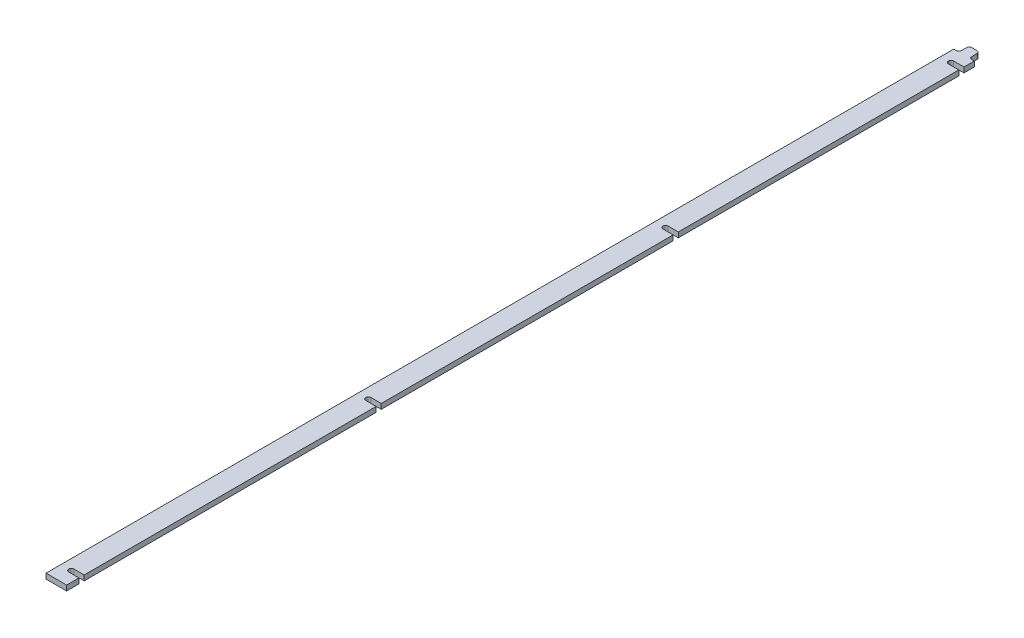
ISO-10303-21;
HEADER;
FILE_DESCRIPTION(('STEP AP214'),'2;1');
FILE_NAME('part.step','',(''),(''),'','','');
FILE_SCHEMA(('AUTOMOTIVE_DESIGN { 1 0 10303 214 1 1 1 1 }'));
ENDSEC;
DATA;
#1=APPLICATION_CONTEXT('core data for automotive mechanical design processes');
#2=APPLICATION_PROTOCOL_DEFINITION('international standard','automotive_design',2000,#1);
#3=PRODUCT_CONTEXT('',#1,'mechanical');
#4=PRODUCT('Part','Part','',(#3));
#5=PRODUCT_RELATED_PRODUCT_CATEGORY('part','',(#4));
#6=PRODUCT_DEFINITION_FORMATION('','',#4);
#7=PRODUCT_DEFINITION_CONTEXT('part definition',#1,'design');
#8=PRODUCT_DEFINITION('design','',#6,#7);
#9=PRODUCT_DEFINITION_SHAPE('','',#8);
#10=(LENGTH_UNIT() NAMED_UNIT(*) SI_UNIT(.MILLI.,.METRE.));
#11=(NAMED_UNIT(*) PLANE_ANGLE_UNIT() SI_UNIT($,.RADIAN.));
#12=(NAMED_UNIT(*) SI_UNIT($,.STERADIAN.) SOLID_ANGLE_UNIT());
#13=UNCERTAINTY_MEASURE_WITH_UNIT(LENGTH_MEASURE(1.E-05),#10,'distance_accuracy_value','');
#14=(GEOMETRIC_REPRESENTATION_CONTEXT(3) GLOBAL_UNCERTAINTY_ASSIGNED_CONTEXT((#13)) GLOBAL_UNIT_ASSIGNED_CONTEXT((#10,
#11,#12)) REPRESENTATION_CONTEXT('',''));
#15=CARTESIAN_POINT('',(0.,0.,0.));
#16=DIRECTION('',(0.,0.,1.));
#17=DIRECTION('',(1.,0.,0.));
#18=AXIS2_PLACEMENT_3D('',#15,#16,#17);
#19=CARTESIAN_POINT('',(-3.17500000000001,-0.000999999999999916,-139.7));
#20=DIRECTION('',(0.,0.,1.));
#21=DIRECTION('',(1.,0.,0.));
#22=AXIS2_PLACEMENT_3D('',#19,#20,#21);
#23=PLANE('',#22);
#24=DIRECTION('',(0.,1.,0.));
#25=VECTOR('',#24,1.);
#26=CARTESIAN_POINT('',(-0.793750000000008,-0.000999999999999916,-139.7));
#27=LINE('',#26,#25);
#28=CARTESIAN_POINT('',(-0.793750000000008,0.,-139.7));
#29=VERTEX_POINT('',#28);
#30=CARTESIAN_POINT('',(-0.793750000000008,1.5875,-139.7));
#31=VERTEX_POINT('',#30);
#32=EDGE_CURVE('E460',#29,#31,#27,.T.);
#33=ORIENTED_EDGE('',*,*,#32,.T.);
#34=DIRECTION('',(1.,0.,0.));
#35=VECTOR('',#34,1.);
#36=CARTESIAN_POINT('',(-3.17500000000001,1.5875,-139.7));
#37=LINE('',#36,#35);
#38=CARTESIAN_POINT('',(0.793749999999993,1.5875,-139.7));
#39=VERTEX_POINT('',#38);
#40=EDGE_CURVE('E519',#31,#39,#37,.T.);
#41=ORIENTED_EDGE('',*,*,#40,.T.);
#42=DIRECTION('',(0.,1.,0.));
#43=VECTOR('',#42,1.);
#44=CARTESIAN_POINT('',(0.793749999999993,-0.000999999999999916,-139.7));
#45=LINE('',#44,#43);
#46=CARTESIAN_POINT('',(0.793749999999993,0.,-139.7));
#47=VERTEX_POINT('',#46);
#48=EDGE_CURVE('E515',#47,#39,#45,.T.);
#49=ORIENTED_EDGE('',*,*,#48,.F.);
#50=DIRECTION('',(-1.,0.,0.));
#51=VECTOR('',#50,1.);
#52=CARTESIAN_POINT('',(-3.17500000000001,0.,-139.7));
#53=LINE('',#52,#51);
#54=EDGE_CURVE('E417',#47,#29,#53,.T.);
#55=ORIENTED_EDGE('',*,*,#54,.T.);
#56=EDGE_LOOP('',(#33,#41,#49,#55));
#57=FACE_BOUND('',#56,.T.);
#58=ADVANCED_FACE('F40',(#57),#23,.F.);
#59=CARTESIAN_POINT('',(3.17499999999999,1.5875,142.875));
#60=DIRECTION('',(-1.,0.,0.));
#61=DIRECTION('',(0.,0.,1.));
#62=AXIS2_PLACEMENT_3D('',#59,#60,#61);
#63=PLANE('',#62);
#64=DIRECTION('',(0.,0.,-1.));
#65=VECTOR('',#64,1.);
#66=CARTESIAN_POINT('',(3.17499999999999,0.,142.875));
#67=LINE('',#66,#65);
#68=CARTESIAN_POINT('',(3.17499999999999,0.,-45.4025));
#69=VERTEX_POINT('',#68);
#70=CARTESIAN_POINT('',(3.17499999999999,0.,-131.7498));
#71=VERTEX_POINT('',#70);
#72=EDGE_CURVE('E330',#69,#71,#67,.T.);
#73=ORIENTED_EDGE('',*,*,#72,.T.);
#74=DIRECTION('',(0.,1.,0.));
#75=VECTOR('',#74,1.);
#76=CARTESIAN_POINT('',(3.17499999999999,-0.000999999999999916,-131.7498));
#77=LINE('',#76,#75);
#78=CARTESIAN_POINT('',(3.17499999999999,1.5875,-131.7498));
#79=VERTEX_POINT('',#78);
#80=EDGE_CURVE('E470',#71,#79,#77,.T.);
#81=ORIENTED_EDGE('',*,*,#80,.T.);
#82=DIRECTION('',(0.,0.,-1.));
#83=VECTOR('',#82,1.);
#84=CARTESIAN_POINT('',(3.17499999999999,1.5875,142.875));
#85=LINE('',#84,#83);
#86=CARTESIAN_POINT('',(3.17499999999999,1.5875,-45.4025));
#87=VERTEX_POINT('',#86);
#88=EDGE_CURVE('E446',#87,#79,#85,.T.);
#89=ORIENTED_EDGE('',*,*,#88,.F.);
#90=DIRECTION('',(0.,1.,0.));
#91=VECTOR('',#90,1.);
#92=CARTESIAN_POINT('',(3.17499999999999,-0.000999999999999916,-45.4025));
#93=LINE('',#92,#91);
#94=EDGE_CURVE('E427',#69,#87,#93,.T.);
#95=ORIENTED_EDGE('',*,*,#94,.F.);
#96=EDGE_LOOP('',(#73,#81,#89,#95));
#97=FACE_BOUND('',#96,.T.);
#98=ADVANCED_FACE('F444',(#97),#63,.F.);
#99=CARTESIAN_POINT('',(3.17499999999999,0.,46.0375));
#100=VERTEX_POINT('',#99);
#101=CARTESIAN_POINT('',(3.17499999999999,0.,-43.815));
#102=VERTEX_POINT('',#101);
#103=EDGE_CURVE('E338',#100,#102,#67,.T.);
#104=ORIENTED_EDGE('',*,*,#103,.T.);
#105=DIRECTION('',(0.,1.,0.));
#106=VECTOR('',#105,1.);
#107=CARTESIAN_POINT('',(3.17499999999999,-0.000999999999999916,-43.815));
#108=LINE('',#107,#106);
#109=CARTESIAN_POINT('',(3.17499999999999,1.5875,-43.815));
#110=VERTEX_POINT('',#109);
#111=EDGE_CURVE('E428',#102,#110,#108,.T.);
#112=ORIENTED_EDGE('',*,*,#111,.T.);
#113=CARTESIAN_POINT('',(3.17499999999999,1.5875,46.0375));
#114=VERTEX_POINT('',#113);
#115=EDGE_CURVE('E401',#114,#110,#85,.T.);
#116=ORIENTED_EDGE('',*,*,#115,.F.);
#117=DIRECTION('',(0.,1.,0.));
#118=VECTOR('',#117,1.);
#119=CARTESIAN_POINT('',(3.17499999999999,-0.000999999999999916,46.0375));
#120=LINE('',#119,#118);
#121=EDGE_CURVE('E383',#100,#114,#120,.T.);
#122=ORIENTED_EDGE('',*,*,#121,.F.);
#123=EDGE_LOOP('',(#104,#112,#116,#122));
#124=FACE_BOUND('',#123,.T.);
#125=ADVANCED_FACE('F399',(#124),#63,.F.);
#126=CARTESIAN_POINT('',(3.17499999999999,0.,137.4775));
#127=VERTEX_POINT('',#126);
#128=CARTESIAN_POINT('',(3.17499999999999,0.,47.625));
#129=VERTEX_POINT('',#128);
#130=EDGE_CURVE('E269',#127,#129,#67,.T.);
#131=ORIENTED_EDGE('',*,*,#130,.T.);
#132=DIRECTION('',(0.,1.,0.));
#133=VECTOR('',#132,1.);
#134=CARTESIAN_POINT('',(3.17499999999999,-0.000999999999999916,47.625));
#135=LINE('',#134,#133);
#136=CARTESIAN_POINT('',(3.17499999999999,1.5875,47.625));
#137=VERTEX_POINT('',#136);
#138=EDGE_CURVE('E356',#129,#137,#135,.T.);
#139=ORIENTED_EDGE('',*,*,#138,.T.);
#140=CARTESIAN_POINT('',(3.17499999999999,1.5875,137.4775));
#141=VERTEX_POINT('',#140);
#142=EDGE_CURVE('E259',#141,#137,#85,.T.);
#143=ORIENTED_EDGE('',*,*,#142,.F.);
#144=DIRECTION('',(0.,1.,0.));
#145=VECTOR('',#144,1.);
#146=CARTESIAN_POINT('',(3.17499999999999,-0.000999999999999916,137.4775));
#147=LINE('',#146,#145);
#148=EDGE_CURVE('E313',#127,#141,#147,.T.);
#149=ORIENTED_EDGE('',*,*,#148,.F.);
#150=EDGE_LOOP('',(#131,#139,#143,#149));
#151=FACE_BOUND('',#150,.T.);
#152=ADVANCED_FACE('F354',(#151),#63,.F.);
#153=CARTESIAN_POINT('',(3.17499999999999,0.,142.875));
#154=VERTEX_POINT('',#153);
#155=CARTESIAN_POINT('',(3.17499999999999,0.,139.065));
#156=VERTEX_POINT('',#155);
#157=EDGE_CURVE('E264',#154,#156,#67,.T.);
#158=ORIENTED_EDGE('',*,*,#157,.T.);
#159=DIRECTION('',(0.,1.,0.));
#160=VECTOR('',#159,1.);
#161=CARTESIAN_POINT('',(3.17499999999999,-0.000999999999999916,139.065));
#162=LINE('',#161,#160);
#163=CARTESIAN_POINT('',(3.17499999999999,1.5875,139.065));
#164=VERTEX_POINT('',#163);
#165=EDGE_CURVE('E314',#156,#164,#162,.T.);
#166=ORIENTED_EDGE('',*,*,#165,.T.);
#167=CARTESIAN_POINT('',(3.17499999999999,1.5875,142.875));
#168=VERTEX_POINT('',#167);
#169=EDGE_CURVE('E253',#168,#164,#85,.T.);
#170=ORIENTED_EDGE('',*,*,#169,.F.);
#171=DIRECTION('',(0.,-1.,0.));
#172=VECTOR('',#171,1.);
#173=CARTESIAN_POINT('',(3.17499999999999,1.5875,142.875));
#174=LINE('',#173,#172);
#175=EDGE_CURVE('E49',#168,#154,#174,.T.);
#176=ORIENTED_EDGE('',*,*,#175,.T.);
#177=EDGE_LOOP('',(#158,#166,#170,#176));
#178=FACE_BOUND('',#177,.T.);
#179=ADVANCED_FACE('F281',(#178),#63,.F.);
#180=CARTESIAN_POINT('',(3.17499999999999,1.5875,-133.3373));
#181=VERTEX_POINT('',#180);
#182=CARTESIAN_POINT('',(3.17499999999999,1.5875,-136.5123));
#183=VERTEX_POINT('',#182);
#184=EDGE_CURVE('E261',#181,#183,#85,.T.);
#185=ORIENTED_EDGE('',*,*,#184,.F.);
#186=DIRECTION('',(0.,1.,0.));
#187=VECTOR('',#186,1.);
#188=CARTESIAN_POINT('',(3.17499999999999,-0.000999999999999916,-133.3373));
#189=LINE('',#188,#187);
#190=CARTESIAN_POINT('',(3.17499999999999,0.,-133.3373));
#191=VERTEX_POINT('',#190);
#192=EDGE_CURVE('E469',#191,#181,#189,.T.);
#193=ORIENTED_EDGE('',*,*,#192,.F.);
#194=CARTESIAN_POINT('',(3.17499999999999,0.,-136.5123));
#195=VERTEX_POINT('',#194);
#196=EDGE_CURVE('E270',#191,#195,#67,.T.);
#197=ORIENTED_EDGE('',*,*,#196,.T.);
#198=DIRECTION('',(0.,1.,0.));
#199=VECTOR('',#198,1.);
#200=CARTESIAN_POINT('',(3.17499999999999,-0.000999999999999916,-136.5123));
#201=LINE('',#200,#199);
#202=EDGE_CURVE('E516',#195,#183,#201,.T.);
#203=ORIENTED_EDGE('',*,*,#202,.T.);
#204=EDGE_LOOP('',(#185,#193,#197,#203));
#205=FACE_BOUND('',#204,.T.);
#206=ADVANCED_FACE('F42',(#205),#63,.F.);
#207=CARTESIAN_POINT('',(-3.17500000000001,1.5875,142.875));
#208=DIRECTION('',(1.,0.,0.));
#209=DIRECTION('',(0.,0.,-1.));
#210=AXIS2_PLACEMENT_3D('',#207,#208,#209);
#211=PLANE('',#210);
#212=DIRECTION('',(0.,0.,1.));
#213=VECTOR('',#212,1.);
#214=CARTESIAN_POINT('',(-3.17500000000001,1.5875,142.875));
#215=LINE('',#214,#213);
#216=CARTESIAN_POINT('',(-3.17500000000001,1.5875,-136.5123));
#217=VERTEX_POINT('',#216);
#218=CARTESIAN_POINT('',(-3.17500000000001,1.5875,142.875));
#219=VERTEX_POINT('',#218);
#220=EDGE_CURVE('E241',#217,#219,#215,.T.);
#221=ORIENTED_EDGE('',*,*,#220,.F.);
#222=DIRECTION('',(0.,1.,0.));
#223=VECTOR('',#222,1.);
#224=CARTESIAN_POINT('',(-3.17500000000001,-0.000999999999999916,-136.5123));
#225=LINE('',#224,#223);
#226=CARTESIAN_POINT('',(-3.17500000000001,0.,-136.5123));
#227=VERTEX_POINT('',#226);
#228=EDGE_CURVE('E226',#227,#217,#225,.T.);
#229=ORIENTED_EDGE('',*,*,#228,.F.);
#230=DIRECTION('',(0.,0.,1.));
#231=VECTOR('',#230,1.);
#232=CARTESIAN_POINT('',(-3.17500000000001,0.,142.875));
#233=LINE('',#232,#231);
#234=CARTESIAN_POINT('',(-3.17500000000001,0.,142.875));
#235=VERTEX_POINT('',#234);
#236=EDGE_CURVE('E268',#227,#235,#233,.T.);
#237=ORIENTED_EDGE('',*,*,#236,.T.);
#238=DIRECTION('',(0.,-1.,0.));
#239=VECTOR('',#238,1.);
#240=CARTESIAN_POINT('',(-3.17500000000001,1.5875,142.875));
#241=LINE('',#240,#239);
#242=EDGE_CURVE('E11',#219,#235,#241,.T.);
#243=ORIENTED_EDGE('',*,*,#242,.F.);
#244=EDGE_LOOP('',(#221,#229,#237,#243));
#245=FACE_BOUND('',#244,.T.);
#246=ADVANCED_FACE('F249',(#245),#211,.F.);
#247=CARTESIAN_POINT('',(3.17499999999999,1.5875,142.875));
#248=DIRECTION('',(0.,0.,-1.));
#249=DIRECTION('',(-1.,0.,0.));
#250=AXIS2_PLACEMENT_3D('',#247,#248,#249);
#251=PLANE('',#250);
#252=DIRECTION('',(1.,0.,0.));
#253=VECTOR('',#252,1.);
#254=CARTESIAN_POINT('',(3.17499999999999,0.,142.875));
#255=LINE('',#254,#253);
#256=EDGE_CURVE('E273',#235,#154,#255,.T.);
#257=ORIENTED_EDGE('',*,*,#256,.T.);
#258=ORIENTED_EDGE('',*,*,#175,.F.);
#259=DIRECTION('',(1.,0.,0.));
#260=VECTOR('',#259,1.);
#261=CARTESIAN_POINT('',(3.17499999999999,1.5875,142.875));
#262=LINE('',#261,#260);
#263=EDGE_CURVE('E252',#219,#168,#262,.T.);
#264=ORIENTED_EDGE('',*,*,#263,.F.);
#265=ORIENTED_EDGE('',*,*,#242,.T.);
#266=EDGE_LOOP('',(#257,#258,#264,#265));
#267=FACE_BOUND('',#266,.T.);
#268=ADVANCED_FACE('F576',(#267),#251,.F.);
#269=CARTESIAN_POINT('',(3.17499999999999,1.5875,-142.875));
#270=DIRECTION('',(0.,1.,0.));
#271=DIRECTION('',(0.,0.,1.));
#272=AXIS2_PLACEMENT_3D('',#269,#270,#271);
#273=PLANE('',#272);
#274=CARTESIAN_POINT('',(-0.793750000000008,1.5875,-138.90625));
#275=DIRECTION('',(0.,-1.,0.));
#276=DIRECTION('',(0.,0.,-1.));
#277=AXIS2_PLACEMENT_3D('',#274,#275,#276);
#278=CIRCLE('',#277,0.793750000000005);
#279=CARTESIAN_POINT('',(-1.58750000000001,1.5875,-138.90625));
#280=VERTEX_POINT('',#279);
#281=EDGE_CURVE('E56',#280,#31,#278,.T.);
#282=ORIENTED_EDGE('',*,*,#281,.F.);
#283=DIRECTION('',(0.,0.,-1.));
#284=VECTOR('',#283,1.);
#285=CARTESIAN_POINT('',(-1.58750000000001,1.5875,-137.30605));
#286=LINE('',#285,#284);
#287=CARTESIAN_POINT('',(-1.58750000000003,1.5875,-137.30605));
#288=VERTEX_POINT('',#287);
#289=EDGE_CURVE('E555',#288,#280,#286,.T.);
#290=ORIENTED_EDGE('',*,*,#289,.F.);
#291=CARTESIAN_POINT('',(-2.38125000000001,1.5875,-137.30605));
#292=DIRECTION('',(0.,1.,0.));
#293=DIRECTION('',(0.,0.,1.));
#294=AXIS2_PLACEMENT_3D('',#291,#292,#293);
#295=CIRCLE('',#294,0.793749999999976);
#296=CARTESIAN_POINT('',(-2.38125000000001,1.5875,-136.5123));
#297=VERTEX_POINT('',#296);
#298=EDGE_CURVE('E245',#297,#288,#295,.T.);
#299=ORIENTED_EDGE('',*,*,#298,.F.);
#300=DIRECTION('',(1.,0.,0.));
#301=VECTOR('',#300,1.);
#302=CARTESIAN_POINT('',(-3.17500000000001,1.5875,-136.5123));
#303=LINE('',#302,#301);
#304=EDGE_CURVE('E229',#217,#297,#303,.T.);
#305=ORIENTED_EDGE('',*,*,#304,.F.);
#306=ORIENTED_EDGE('',*,*,#220,.T.);
#307=ORIENTED_EDGE('',*,*,#263,.T.);
#308=ORIENTED_EDGE('',*,*,#169,.T.);
#309=DIRECTION('',(1.,0.,0.));
#310=VECTOR('',#309,1.);
#311=CARTESIAN_POINT('',(3.17499999999999,1.5875,139.065));
#312=LINE('',#311,#310);
#313=CARTESIAN_POINT('',(0.,1.5875,139.065));
#314=VERTEX_POINT('',#313);
#315=EDGE_CURVE('E310',#314,#164,#312,.T.);
#316=ORIENTED_EDGE('',*,*,#315,.F.);
#317=CARTESIAN_POINT('',(0.,1.5875,138.27125));
#318=DIRECTION('',(0.,1.,0.));
#319=DIRECTION('',(0.,0.,1.));
#320=AXIS2_PLACEMENT_3D('',#317,#318,#319);
#321=CIRCLE('',#320,0.793749999999996);
#322=CARTESIAN_POINT('',(0.,1.5875,137.4775));
#323=VERTEX_POINT('',#322);
#324=EDGE_CURVE('E301',#323,#314,#321,.T.);
#325=ORIENTED_EDGE('',*,*,#324,.F.);
#326=DIRECTION('',(-1.,0.,0.));
#327=VECTOR('',#326,1.);
#328=CARTESIAN_POINT('',(3.17499999999999,1.5875,137.4775));
#329=LINE('',#328,#327);
#330=EDGE_CURVE('E296',#141,#323,#329,.T.);
#331=ORIENTED_EDGE('',*,*,#330,.F.);
#332=ORIENTED_EDGE('',*,*,#142,.T.);
#333=DIRECTION('',(1.,0.,0.));
#334=VECTOR('',#333,1.);
#335=CARTESIAN_POINT('',(3.17499999999999,1.5875,47.625));
#336=LINE('',#335,#334);
#337=CARTESIAN_POINT('',(0.,1.5875,47.625));
#338=VERTEX_POINT('',#337);
#339=EDGE_CURVE('E380',#338,#137,#336,.T.);
#340=ORIENTED_EDGE('',*,*,#339,.F.);
#341=CARTESIAN_POINT('',(0.,1.5875,46.83125));
#342=DIRECTION('',(0.,1.,0.));
#343=DIRECTION('',(0.,0.,1.));
#344=AXIS2_PLACEMENT_3D('',#341,#342,#343);
#345=CIRCLE('',#344,0.793749999999996);
#346=CARTESIAN_POINT('',(0.,1.5875,46.0375));
#347=VERTEX_POINT('',#346);
#348=EDGE_CURVE('E371',#347,#338,#345,.T.);
#349=ORIENTED_EDGE('',*,*,#348,.F.);
#350=DIRECTION('',(-1.,0.,0.));
#351=VECTOR('',#350,1.);
#352=CARTESIAN_POINT('',(3.17499999999999,1.5875,46.0375));
#353=LINE('',#352,#351);
#354=EDGE_CURVE('E366',#114,#347,#353,.T.);
#355=ORIENTED_EDGE('',*,*,#354,.F.);
#356=ORIENTED_EDGE('',*,*,#115,.T.);
#357=DIRECTION('',(1.,0.,0.));
#358=VECTOR('',#357,1.);
#359=CARTESIAN_POINT('',(3.17499999999999,1.5875,-43.815));
#360=LINE('',#359,#358);
#361=CARTESIAN_POINT('',(0.,1.5875,-43.815));
#362=VERTEX_POINT('',#361);
#363=EDGE_CURVE('E424',#362,#110,#360,.T.);
#364=ORIENTED_EDGE('',*,*,#363,.F.);
#365=CARTESIAN_POINT('',(0.,1.5875,-44.60875));
#366=DIRECTION('',(0.,1.,0.));
#367=DIRECTION('',(0.,0.,1.));
#368=AXIS2_PLACEMENT_3D('',#365,#366,#367);
#369=CIRCLE('',#368,0.793749999999996);
#370=CARTESIAN_POINT('',(0.,1.5875,-45.4025));
#371=VERTEX_POINT('',#370);
#372=EDGE_CURVE('E415',#371,#362,#369,.T.);
#373=ORIENTED_EDGE('',*,*,#372,.F.);
#374=DIRECTION('',(-1.,0.,0.));
#375=VECTOR('',#374,1.);
#376=CARTESIAN_POINT('',(3.17499999999999,1.5875,-45.4025));
#377=LINE('',#376,#375);
#378=EDGE_CURVE('E410',#87,#371,#377,.T.);
#379=ORIENTED_EDGE('',*,*,#378,.F.);
#380=ORIENTED_EDGE('',*,*,#88,.T.);
#381=DIRECTION('',(1.,0.,0.));
#382=VECTOR('',#381,1.);
#383=CARTESIAN_POINT('',(0.,1.5875,-131.7498));
#384=LINE('',#383,#382);
#385=CARTESIAN_POINT('',(0.,1.5875,-131.7498));
#386=VERTEX_POINT('',#385);
#387=EDGE_CURVE('E466',#386,#79,#384,.T.);
#388=ORIENTED_EDGE('',*,*,#387,.F.);
#389=CARTESIAN_POINT('',(0.,1.5875,-132.54355));
#390=DIRECTION('',(0.,1.,0.));
#391=DIRECTION('',(0.,0.,1.));
#392=AXIS2_PLACEMENT_3D('',#389,#390,#391);
#393=CIRCLE('',#392,0.793749999999996);
#394=CARTESIAN_POINT('',(0.,1.5875,-133.3373));
#395=VERTEX_POINT('',#394);
#396=EDGE_CURVE('E458',#395,#386,#393,.T.);
#397=ORIENTED_EDGE('',*,*,#396,.F.);
#398=DIRECTION('',(-1.,0.,0.));
#399=VECTOR('',#398,1.);
#400=CARTESIAN_POINT('',(0.,1.5875,-133.3373));
#401=LINE('',#400,#399);
#402=EDGE_CURVE('E453',#181,#395,#401,.T.);
#403=ORIENTED_EDGE('',*,*,#402,.F.);
#404=ORIENTED_EDGE('',*,*,#184,.T.);
#405=DIRECTION('',(1.,0.,0.));
#406=VECTOR('',#405,1.);
#407=CARTESIAN_POINT('',(3.17499999999999,1.5875,-136.5123));
#408=LINE('',#407,#406);
#409=CARTESIAN_POINT('',(2.38124999999999,1.5875,-136.5123));
#410=VERTEX_POINT('',#409);
#411=EDGE_CURVE('E511',#410,#183,#408,.T.);
#412=ORIENTED_EDGE('',*,*,#411,.F.);
#413=CARTESIAN_POINT('',(2.38124999999999,1.5875,-137.30605));
#414=DIRECTION('',(0.,1.,0.));
#415=DIRECTION('',(0.,0.,-1.));
#416=AXIS2_PLACEMENT_3D('',#413,#414,#415);
#417=CIRCLE('',#416,0.793749999999976);
#418=CARTESIAN_POINT('',(1.58750000000001,1.5875,-137.30605));
#419=VERTEX_POINT('',#418);
#420=EDGE_CURVE('E507',#419,#410,#417,.T.);
#421=ORIENTED_EDGE('',*,*,#420,.F.);
#422=DIRECTION('',(0.,0.,1.));
#423=VECTOR('',#422,1.);
#424=CARTESIAN_POINT('',(1.58749999999999,1.5875,-137.30605));
#425=LINE('',#424,#423);
#426=CARTESIAN_POINT('',(1.58749999999999,1.5875,-138.90625));
#427=VERTEX_POINT('',#426);
#428=EDGE_CURVE('E503',#427,#419,#425,.T.);
#429=ORIENTED_EDGE('',*,*,#428,.F.);
#430=CARTESIAN_POINT('',(0.793749999999992,1.5875,-138.90625));
#431=DIRECTION('',(0.,-1.,0.));
#432=DIRECTION('',(0.,0.,1.));
#433=AXIS2_PLACEMENT_3D('',#430,#431,#432);
#434=CIRCLE('',#433,0.793750000000005);
#435=EDGE_CURVE('E499',#39,#427,#434,.T.);
#436=ORIENTED_EDGE('',*,*,#435,.F.);
#437=ORIENTED_EDGE('',*,*,#40,.F.);
#438=EDGE_LOOP('',(#282,#290,#299,#305,#306,#307,#308,#316,#325,#331,#332,#340,#349,#355,#356,
#364,#373,#379,#380,#388,#397,#403,#404,#412,#421,#429,#436,#437));
#439=FACE_BOUND('',#438,.T.);
#440=ADVANCED_FACE('F240',(#439),#273,.T.);
#441=CARTESIAN_POINT('',(3.17499999999999,0.,-142.875));
#442=DIRECTION('',(0.,1.,0.));
#443=DIRECTION('',(0.,0.,1.));
#444=AXIS2_PLACEMENT_3D('',#441,#442,#443);
#445=PLANE('',#444);
#446=DIRECTION('',(0.,0.,1.));
#447=VECTOR('',#446,1.);
#448=CARTESIAN_POINT('',(-1.58750000000001,0.,-137.30605));
#449=LINE('',#448,#447);
#450=CARTESIAN_POINT('',(-1.58750000000001,0.,-138.90625));
#451=VERTEX_POINT('',#450);
#452=CARTESIAN_POINT('',(-1.58750000000003,0.,-137.30605));
#453=VERTEX_POINT('',#452);
#454=EDGE_CURVE('E545',#451,#453,#449,.T.);
#455=ORIENTED_EDGE('',*,*,#454,.F.);
#456=CARTESIAN_POINT('',(-0.793750000000008,0.,-138.90625));
#457=DIRECTION('',(0.,1.,0.));
#458=DIRECTION('',(0.,0.,1.));
#459=AXIS2_PLACEMENT_3D('',#456,#457,#458);
#460=CIRCLE('',#459,0.793750000000005);
#461=EDGE_CURVE('E247',#29,#451,#460,.T.);
#462=ORIENTED_EDGE('',*,*,#461,.F.);
#463=ORIENTED_EDGE('',*,*,#54,.F.);
#464=CARTESIAN_POINT('',(0.793749999999992,0.,-138.90625));
#465=DIRECTION('',(0.,1.,0.));
#466=DIRECTION('',(0.,0.,1.));
#467=AXIS2_PLACEMENT_3D('',#464,#465,#466);
#468=CIRCLE('',#467,0.793750000000005);
#469=CARTESIAN_POINT('',(1.58749999999999,0.,-138.90625));
#470=VERTEX_POINT('',#469);
#471=EDGE_CURVE('E484',#470,#47,#468,.T.);
#472=ORIENTED_EDGE('',*,*,#471,.F.);
#473=DIRECTION('',(0.,0.,-1.));
#474=VECTOR('',#473,1.);
#475=CARTESIAN_POINT('',(1.58749999999999,0.,-137.30605));
#476=LINE('',#475,#474);
#477=CARTESIAN_POINT('',(1.58750000000001,0.,-137.30605));
#478=VERTEX_POINT('',#477);
#479=EDGE_CURVE('E487',#478,#470,#476,.T.);
#480=ORIENTED_EDGE('',*,*,#479,.F.);
#481=CARTESIAN_POINT('',(2.38124999999999,0.,-137.30605));
#482=DIRECTION('',(0.,1.,0.));
#483=DIRECTION('',(0.,0.,1.));
#484=AXIS2_PLACEMENT_3D('',#481,#482,#483);
#485=CIRCLE('',#484,0.793749999999976);
#486=CARTESIAN_POINT('',(2.38124999999999,0.,-136.5123));
#487=VERTEX_POINT('',#486);
#488=EDGE_CURVE('E491',#487,#478,#485,.F.);
#489=ORIENTED_EDGE('',*,*,#488,.F.);
#490=DIRECTION('',(-1.,0.,0.));
#491=VECTOR('',#490,1.);
#492=CARTESIAN_POINT('',(3.17499999999999,0.,-136.5123));
#493=LINE('',#492,#491);
#494=EDGE_CURVE('E495',#195,#487,#493,.T.);
#495=ORIENTED_EDGE('',*,*,#494,.F.);
#496=ORIENTED_EDGE('',*,*,#196,.F.);
#497=DIRECTION('',(1.,0.,0.));
#498=VECTOR('',#497,1.);
#499=CARTESIAN_POINT('',(0.,0.,-133.3373));
#500=LINE('',#499,#498);
#501=CARTESIAN_POINT('',(0.,0.,-133.3373));
#502=VERTEX_POINT('',#501);
#503=EDGE_CURVE('E473',#502,#191,#500,.T.);
#504=ORIENTED_EDGE('',*,*,#503,.F.);
#505=CARTESIAN_POINT('',(0.,0.,-132.54355));
#506=DIRECTION('',(0.,1.,0.));
#507=DIRECTION('',(0.,0.,1.));
#508=AXIS2_PLACEMENT_3D('',#505,#506,#507);
#509=CIRCLE('',#508,0.793749999999996);
#510=CARTESIAN_POINT('',(0.,0.,-131.7498));
#511=VERTEX_POINT('',#510);
#512=EDGE_CURVE('E64',#511,#502,#509,.F.);
#513=ORIENTED_EDGE('',*,*,#512,.F.);
#514=DIRECTION('',(-1.,0.,0.));
#515=VECTOR('',#514,1.);
#516=CARTESIAN_POINT('',(0.,0.,-131.7498));
#517=LINE('',#516,#515);
#518=EDGE_CURVE('E449',#71,#511,#517,.T.);
#519=ORIENTED_EDGE('',*,*,#518,.F.);
#520=ORIENTED_EDGE('',*,*,#72,.F.);
#521=DIRECTION('',(1.,0.,0.));
#522=VECTOR('',#521,1.);
#523=CARTESIAN_POINT('',(3.17499999999999,0.,-45.4025));
#524=LINE('',#523,#522);
#525=CARTESIAN_POINT('',(0.,0.,-45.4025));
#526=VERTEX_POINT('',#525);
#527=EDGE_CURVE('E373',#526,#69,#524,.T.);
#528=ORIENTED_EDGE('',*,*,#527,.F.);
#529=CARTESIAN_POINT('',(0.,0.,-44.60875));
#530=DIRECTION('',(0.,1.,0.));
#531=DIRECTION('',(0.,0.,1.));
#532=AXIS2_PLACEMENT_3D('',#529,#530,#531);
#533=CIRCLE('',#532,0.793749999999996);
#534=CARTESIAN_POINT('',(0.,0.,-43.815));
#535=VERTEX_POINT('',#534);
#536=EDGE_CURVE('E407',#535,#526,#533,.F.);
#537=ORIENTED_EDGE('',*,*,#536,.F.);
#538=DIRECTION('',(-1.,0.,0.));
#539=VECTOR('',#538,1.);
#540=CARTESIAN_POINT('',(3.17499999999999,0.,-43.815));
#541=LINE('',#540,#539);
#542=EDGE_CURVE('E405',#102,#535,#541,.T.);
#543=ORIENTED_EDGE('',*,*,#542,.F.);
#544=ORIENTED_EDGE('',*,*,#103,.F.);
#545=DIRECTION('',(1.,0.,0.));
#546=VECTOR('',#545,1.);
#547=CARTESIAN_POINT('',(3.17499999999999,0.,46.0375));
#548=LINE('',#547,#546);
#549=CARTESIAN_POINT('',(0.,0.,46.0375));
#550=VERTEX_POINT('',#549);
#551=EDGE_CURVE('E303',#550,#100,#548,.T.);
#552=ORIENTED_EDGE('',*,*,#551,.F.);
#553=CARTESIAN_POINT('',(0.,0.,46.83125));
#554=DIRECTION('',(0.,1.,0.));
#555=DIRECTION('',(0.,0.,1.));
#556=AXIS2_PLACEMENT_3D('',#553,#554,#555);
#557=CIRCLE('',#556,0.793749999999996);
#558=CARTESIAN_POINT('',(0.,0.,47.625));
#559=VERTEX_POINT('',#558);
#560=EDGE_CURVE('E363',#559,#550,#557,.F.);
#561=ORIENTED_EDGE('',*,*,#560,.F.);
#562=DIRECTION('',(-1.,0.,0.));
#563=VECTOR('',#562,1.);
#564=CARTESIAN_POINT('',(3.17499999999999,0.,47.625));
#565=LINE('',#564,#563);
#566=EDGE_CURVE('E361',#129,#559,#565,.T.);
#567=ORIENTED_EDGE('',*,*,#566,.F.);
#568=ORIENTED_EDGE('',*,*,#130,.F.);
#569=DIRECTION('',(1.,0.,0.));
#570=VECTOR('',#569,1.);
#571=CARTESIAN_POINT('',(3.17499999999999,0.,137.4775));
#572=LINE('',#571,#570);
#573=CARTESIAN_POINT('',(0.,0.,137.4775));
#574=VERTEX_POINT('',#573);
#575=EDGE_CURVE('E317',#574,#127,#572,.T.);
#576=ORIENTED_EDGE('',*,*,#575,.F.);
#577=CARTESIAN_POINT('',(0.,0.,138.27125));
#578=DIRECTION('',(0.,1.,0.));
#579=DIRECTION('',(0.,0.,1.));
#580=AXIS2_PLACEMENT_3D('',#577,#578,#579);
#581=CIRCLE('',#580,0.793749999999996);
#582=CARTESIAN_POINT('',(0.,0.,139.065));
#583=VERTEX_POINT('',#582);
#584=EDGE_CURVE('E293',#583,#574,#581,.F.);
#585=ORIENTED_EDGE('',*,*,#584,.F.);
#586=DIRECTION('',(-1.,0.,0.));
#587=VECTOR('',#586,1.);
#588=CARTESIAN_POINT('',(3.17499999999999,0.,139.065));
#589=LINE('',#588,#587);
#590=EDGE_CURVE('E291',#156,#583,#589,.T.);
#591=ORIENTED_EDGE('',*,*,#590,.F.);
#592=ORIENTED_EDGE('',*,*,#157,.F.);
#593=ORIENTED_EDGE('',*,*,#256,.F.);
#594=ORIENTED_EDGE('',*,*,#236,.F.);
#595=DIRECTION('',(-1.,0.,0.));
#596=VECTOR('',#595,1.);
#597=CARTESIAN_POINT('',(-3.17500000000001,0.,-136.5123));
#598=LINE('',#597,#596);
#599=CARTESIAN_POINT('',(-2.38125000000001,0.,-136.5123));
#600=VERTEX_POINT('',#599);
#601=EDGE_CURVE('E232',#600,#227,#598,.T.);
#602=ORIENTED_EDGE('',*,*,#601,.F.);
#603=CARTESIAN_POINT('',(-2.38125000000001,0.,-137.30605));
#604=DIRECTION('',(0.,1.,0.));
#605=DIRECTION('',(0.,0.,1.));
#606=AXIS2_PLACEMENT_3D('',#603,#604,#605);
#607=CIRCLE('',#606,0.793749999999976);
#608=EDGE_CURVE('E549',#453,#600,#607,.F.);
#609=ORIENTED_EDGE('',*,*,#608,.F.);
#610=EDGE_LOOP('',(#455,#462,#463,#472,#480,#489,#495,#496,#504,#513,#519,#520,#528,#537,#543,
#544,#552,#561,#567,#568,#576,#585,#591,#592,#593,#594,#602,#609));
#611=FACE_BOUND('',#610,.T.);
#612=ADVANCED_FACE('F288',(#611),#445,.F.);
#613=CARTESIAN_POINT('',(3.17499999999999,-0.000999999999999916,139.065));
#614=DIRECTION('',(0.,0.,1.));
#615=DIRECTION('',(1.,0.,0.));
#616=AXIS2_PLACEMENT_3D('',#613,#614,#615);
#617=PLANE('',#616);
#618=ORIENTED_EDGE('',*,*,#590,.T.);
#619=DIRECTION('',(0.,1.,0.));
#620=VECTOR('',#619,1.);
#621=CARTESIAN_POINT('',(0.,-0.000999999999999916,139.065));
#622=LINE('',#621,#620);
#623=EDGE_CURVE('E318',#583,#314,#622,.T.);
#624=ORIENTED_EDGE('',*,*,#623,.T.);
#625=ORIENTED_EDGE('',*,*,#315,.T.);
#626=ORIENTED_EDGE('',*,*,#165,.F.);
#627=EDGE_LOOP('',(#618,#624,#625,#626));
#628=FACE_BOUND('',#627,.T.);
#629=ADVANCED_FACE('F580',(#628),#617,.F.);
#630=CARTESIAN_POINT('',(0.,-0.000999999999999916,138.27125));
#631=DIRECTION('',(0.,1.,0.));
#632=DIRECTION('',(0.,0.,1.));
#633=AXIS2_PLACEMENT_3D('',#630,#631,#632);
#634=CYLINDRICAL_SURFACE('',#633,0.793749999999996);
#635=ORIENTED_EDGE('',*,*,#584,.T.);
#636=DIRECTION('',(0.,1.,0.));
#637=VECTOR('',#636,1.);
#638=CARTESIAN_POINT('',(0.,-0.000999999999999916,137.4775));
#639=LINE('',#638,#637);
#640=EDGE_CURVE('E321',#574,#323,#639,.T.);
#641=ORIENTED_EDGE('',*,*,#640,.T.);
#642=ORIENTED_EDGE('',*,*,#324,.T.);
#643=ORIENTED_EDGE('',*,*,#623,.F.);
#644=EDGE_LOOP('',(#635,#641,#642,#643));
#645=FACE_BOUND('',#644,.T.);
#646=ADVANCED_FACE('F582',(#645),#634,.F.);
#647=CARTESIAN_POINT('',(3.17499999999999,-0.000999999999999916,137.4775));
#648=DIRECTION('',(0.,0.,-1.));
#649=DIRECTION('',(-1.,0.,0.));
#650=AXIS2_PLACEMENT_3D('',#647,#648,#649);
#651=PLANE('',#650);
#652=ORIENTED_EDGE('',*,*,#575,.T.);
#653=ORIENTED_EDGE('',*,*,#148,.T.);
#654=ORIENTED_EDGE('',*,*,#330,.T.);
#655=ORIENTED_EDGE('',*,*,#640,.F.);
#656=EDGE_LOOP('',(#652,#653,#654,#655));
#657=FACE_BOUND('',#656,.T.);
#658=ADVANCED_FACE('F583',(#657),#651,.F.);
#659=CARTESIAN_POINT('',(3.17499999999999,-0.000999999999999916,47.625));
#660=DIRECTION('',(0.,0.,1.));
#661=DIRECTION('',(1.,0.,0.));
#662=AXIS2_PLACEMENT_3D('',#659,#660,#661);
#663=PLANE('',#662);
#664=ORIENTED_EDGE('',*,*,#566,.T.);
#665=DIRECTION('',(0.,1.,0.));
#666=VECTOR('',#665,1.);
#667=CARTESIAN_POINT('',(0.,-0.000999999999999916,47.625));
#668=LINE('',#667,#666);
#669=EDGE_CURVE('E386',#559,#338,#668,.T.);
#670=ORIENTED_EDGE('',*,*,#669,.T.);
#671=ORIENTED_EDGE('',*,*,#339,.T.);
#672=ORIENTED_EDGE('',*,*,#138,.F.);
#673=EDGE_LOOP('',(#664,#670,#671,#672));
#674=FACE_BOUND('',#673,.T.);
#675=ADVANCED_FACE('F622',(#674),#663,.F.);
#676=CARTESIAN_POINT('',(0.,-0.000999999999999916,46.83125));
#677=DIRECTION('',(0.,1.,0.));
#678=DIRECTION('',(0.,0.,1.));
#679=AXIS2_PLACEMENT_3D('',#676,#677,#678);
#680=CYLINDRICAL_SURFACE('',#679,0.793749999999996);
#681=ORIENTED_EDGE('',*,*,#560,.T.);
#682=DIRECTION('',(0.,1.,0.));
#683=VECTOR('',#682,1.);
#684=CARTESIAN_POINT('',(0.,-0.000999999999999916,46.0375));
#685=LINE('',#684,#683);
#686=EDGE_CURVE('E389',#550,#347,#685,.T.);
#687=ORIENTED_EDGE('',*,*,#686,.T.);
#688=ORIENTED_EDGE('',*,*,#348,.T.);
#689=ORIENTED_EDGE('',*,*,#669,.F.);
#690=EDGE_LOOP('',(#681,#687,#688,#689));
#691=FACE_BOUND('',#690,.T.);
#692=ADVANCED_FACE('F625',(#691),#680,.F.);
#693=CARTESIAN_POINT('',(3.17499999999999,-0.000999999999999916,46.0375));
#694=DIRECTION('',(0.,0.,-1.));
#695=DIRECTION('',(-1.,0.,0.));
#696=AXIS2_PLACEMENT_3D('',#693,#694,#695);
#697=PLANE('',#696);
#698=ORIENTED_EDGE('',*,*,#551,.T.);
#699=ORIENTED_EDGE('',*,*,#121,.T.);
#700=ORIENTED_EDGE('',*,*,#354,.T.);
#701=ORIENTED_EDGE('',*,*,#686,.F.);
#702=EDGE_LOOP('',(#698,#699,#700,#701));
#703=FACE_BOUND('',#702,.T.);
#704=ADVANCED_FACE('F396',(#703),#697,.F.);
#705=CARTESIAN_POINT('',(3.17499999999999,-0.000999999999999916,-43.815));
#706=DIRECTION('',(0.,0.,1.));
#707=DIRECTION('',(1.,0.,0.));
#708=AXIS2_PLACEMENT_3D('',#705,#706,#707);
#709=PLANE('',#708);
#710=ORIENTED_EDGE('',*,*,#542,.T.);
#711=DIRECTION('',(0.,1.,0.));
#712=VECTOR('',#711,1.);
#713=CARTESIAN_POINT('',(0.,-0.000999999999999916,-43.815));
#714=LINE('',#713,#712);
#715=EDGE_CURVE('E431',#535,#362,#714,.T.);
#716=ORIENTED_EDGE('',*,*,#715,.T.);
#717=ORIENTED_EDGE('',*,*,#363,.T.);
#718=ORIENTED_EDGE('',*,*,#111,.F.);
#719=EDGE_LOOP('',(#710,#716,#717,#718));
#720=FACE_BOUND('',#719,.T.);
#721=ADVANCED_FACE('F613',(#720),#709,.F.);
#722=CARTESIAN_POINT('',(0.,-0.000999999999999916,-44.60875));
#723=DIRECTION('',(0.,1.,0.));
#724=DIRECTION('',(0.,0.,1.));
#725=AXIS2_PLACEMENT_3D('',#722,#723,#724);
#726=CYLINDRICAL_SURFACE('',#725,0.793749999999996);
#727=ORIENTED_EDGE('',*,*,#536,.T.);
#728=DIRECTION('',(0.,1.,0.));
#729=VECTOR('',#728,1.);
#730=CARTESIAN_POINT('',(0.,-0.000999999999999916,-45.4025));
#731=LINE('',#730,#729);
#732=EDGE_CURVE('E434',#526,#371,#731,.T.);
#733=ORIENTED_EDGE('',*,*,#732,.T.);
#734=ORIENTED_EDGE('',*,*,#372,.T.);
#735=ORIENTED_EDGE('',*,*,#715,.F.);
#736=EDGE_LOOP('',(#727,#733,#734,#735));
#737=FACE_BOUND('',#736,.T.);
#738=ADVANCED_FACE('F616',(#737),#726,.F.);
#739=CARTESIAN_POINT('',(3.17499999999999,-0.000999999999999916,-45.4025));
#740=DIRECTION('',(0.,0.,-1.));
#741=DIRECTION('',(-1.,0.,0.));
#742=AXIS2_PLACEMENT_3D('',#739,#740,#741);
#743=PLANE('',#742);
#744=ORIENTED_EDGE('',*,*,#527,.T.);
#745=ORIENTED_EDGE('',*,*,#94,.T.);
#746=ORIENTED_EDGE('',*,*,#378,.T.);
#747=ORIENTED_EDGE('',*,*,#732,.F.);
#748=EDGE_LOOP('',(#744,#745,#746,#747));
#749=FACE_BOUND('',#748,.T.);
#750=ADVANCED_FACE('F441',(#749),#743,.F.);
#751=CARTESIAN_POINT('',(3.17499999999999,-0.000999999999999916,-136.5123));
#752=DIRECTION('',(0.,0.,1.));
#753=DIRECTION('',(1.,0.,0.));
#754=AXIS2_PLACEMENT_3D('',#751,#752,#753);
#755=PLANE('',#754);
#756=ORIENTED_EDGE('',*,*,#494,.T.);
#757=DIRECTION('',(0.,1.,0.));
#758=VECTOR('',#757,1.);
#759=CARTESIAN_POINT('',(2.38124999999999,-0.000999999999999916,-136.5123));
#760=LINE('',#759,#758);
#761=EDGE_CURVE('E520',#487,#410,#760,.T.);
#762=ORIENTED_EDGE('',*,*,#761,.T.);
#763=ORIENTED_EDGE('',*,*,#411,.T.);
#764=ORIENTED_EDGE('',*,*,#202,.F.);
#765=EDGE_LOOP('',(#756,#762,#763,#764));
#766=FACE_BOUND('',#765,.T.);
#767=ADVANCED_FACE('F597',(#766),#755,.F.);
#768=CARTESIAN_POINT('',(2.38124999999999,-0.000999999999999916,-137.30605));
#769=DIRECTION('',(0.,1.,0.));
#770=DIRECTION('',(0.,0.,1.));
#771=AXIS2_PLACEMENT_3D('',#768,#769,#770);
#772=CYLINDRICAL_SURFACE('',#771,0.793749999999976);
#773=ORIENTED_EDGE('',*,*,#488,.T.);
#774=DIRECTION('',(0.,1.,0.));
#775=VECTOR('',#774,1.);
#776=CARTESIAN_POINT('',(1.58750000000001,-0.000999999999999916,-137.30605));
#777=LINE('',#776,#775);
#778=EDGE_CURVE('E523',#478,#419,#777,.T.);
#779=ORIENTED_EDGE('',*,*,#778,.T.);
#780=ORIENTED_EDGE('',*,*,#420,.T.);
#781=ORIENTED_EDGE('',*,*,#761,.F.);
#782=EDGE_LOOP('',(#773,#779,#780,#781));
#783=FACE_BOUND('',#782,.T.);
#784=ADVANCED_FACE('F684',(#783),#772,.F.);
#785=CARTESIAN_POINT('',(1.58749999999999,-0.000999999999999916,-137.30605));
#786=DIRECTION('',(-1.,0.,0.));
#787=DIRECTION('',(0.,0.,1.));
#788=AXIS2_PLACEMENT_3D('',#785,#786,#787);
#789=PLANE('',#788);
#790=ORIENTED_EDGE('',*,*,#479,.T.);
#791=DIRECTION('',(0.,1.,0.));
#792=VECTOR('',#791,1.);
#793=CARTESIAN_POINT('',(1.58749999999999,-0.000999999999999916,-138.90625));
#794=LINE('',#793,#792);
#795=EDGE_CURVE('E526',#470,#427,#794,.T.);
#796=ORIENTED_EDGE('',*,*,#795,.T.);
#797=ORIENTED_EDGE('',*,*,#428,.T.);
#798=ORIENTED_EDGE('',*,*,#778,.F.);
#799=EDGE_LOOP('',(#790,#796,#797,#798));
#800=FACE_BOUND('',#799,.T.);
#801=ADVANCED_FACE('F690',(#800),#789,.F.);
#802=CARTESIAN_POINT('',(0.793749999999992,-0.000999999999999916,-138.90625));
#803=DIRECTION('',(0.,1.,0.));
#804=DIRECTION('',(0.,0.,1.));
#805=AXIS2_PLACEMENT_3D('',#802,#803,#804);
#806=CYLINDRICAL_SURFACE('',#805,0.793750000000005);
#807=ORIENTED_EDGE('',*,*,#471,.T.);
#808=ORIENTED_EDGE('',*,*,#48,.T.);
#809=ORIENTED_EDGE('',*,*,#435,.T.);
#810=ORIENTED_EDGE('',*,*,#795,.F.);
#811=EDGE_LOOP('',(#807,#808,#809,#810));
#812=FACE_BOUND('',#811,.T.);
#813=ADVANCED_FACE('F611',(#812),#806,.T.);
#814=CARTESIAN_POINT('',(0.,-0.000999999999999916,-131.7498));
#815=DIRECTION('',(0.,0.,1.));
#816=DIRECTION('',(1.,0.,0.));
#817=AXIS2_PLACEMENT_3D('',#814,#815,#816);
#818=PLANE('',#817);
#819=ORIENTED_EDGE('',*,*,#518,.T.);
#820=DIRECTION('',(0.,1.,0.));
#821=VECTOR('',#820,1.);
#822=CARTESIAN_POINT('',(0.,-0.000999999999999916,-131.7498));
#823=LINE('',#822,#821);
#824=EDGE_CURVE('E474',#511,#386,#823,.T.);
#825=ORIENTED_EDGE('',*,*,#824,.T.);
#826=ORIENTED_EDGE('',*,*,#387,.T.);
#827=ORIENTED_EDGE('',*,*,#80,.F.);
#828=EDGE_LOOP('',(#819,#825,#826,#827));
#829=FACE_BOUND('',#828,.T.);
#830=ADVANCED_FACE('F702',(#829),#818,.F.);
#831=CARTESIAN_POINT('',(0.,-0.000999999999999916,-132.54355));
#832=DIRECTION('',(0.,1.,0.));
#833=DIRECTION('',(0.,0.,1.));
#834=AXIS2_PLACEMENT_3D('',#831,#832,#833);
#835=CYLINDRICAL_SURFACE('',#834,0.793749999999996);
#836=ORIENTED_EDGE('',*,*,#512,.T.);
#837=DIRECTION('',(0.,1.,0.));
#838=VECTOR('',#837,1.);
#839=CARTESIAN_POINT('',(0.,-0.000999999999999916,-133.3373));
#840=LINE('',#839,#838);
#841=EDGE_CURVE('E477',#502,#395,#840,.T.);
#842=ORIENTED_EDGE('',*,*,#841,.T.);
#843=ORIENTED_EDGE('',*,*,#396,.T.);
#844=ORIENTED_EDGE('',*,*,#824,.F.);
#845=EDGE_LOOP('',(#836,#842,#843,#844));
#846=FACE_BOUND('',#845,.T.);
#847=ADVANCED_FACE('F708',(#846),#835,.F.);
#848=CARTESIAN_POINT('',(0.,-0.000999999999999916,-133.3373));
#849=DIRECTION('',(0.,0.,-1.));
#850=DIRECTION('',(-1.,0.,0.));
#851=AXIS2_PLACEMENT_3D('',#848,#849,#850);
#852=PLANE('',#851);
#853=ORIENTED_EDGE('',*,*,#503,.T.);
#854=ORIENTED_EDGE('',*,*,#192,.T.);
#855=ORIENTED_EDGE('',*,*,#402,.T.);
#856=ORIENTED_EDGE('',*,*,#841,.F.);
#857=EDGE_LOOP('',(#853,#854,#855,#856));
#858=FACE_BOUND('',#857,.T.);
#859=ADVANCED_FACE('F714',(#858),#852,.F.);
#860=CARTESIAN_POINT('',(-0.793750000000008,-0.000999999999999916,-138.90625));
#861=DIRECTION('',(0.,1.,0.));
#862=DIRECTION('',(0.,0.,1.));
#863=AXIS2_PLACEMENT_3D('',#860,#861,#862);
#864=CYLINDRICAL_SURFACE('',#863,0.793750000000005);
#865=ORIENTED_EDGE('',*,*,#461,.T.);
#866=DIRECTION('',(0.,1.,0.));
#867=VECTOR('',#866,1.);
#868=CARTESIAN_POINT('',(-1.58750000000001,-0.000999999999999916,-138.90625));
#869=LINE('',#868,#867);
#870=EDGE_CURVE('E563',#451,#280,#869,.T.);
#871=ORIENTED_EDGE('',*,*,#870,.T.);
#872=ORIENTED_EDGE('',*,*,#281,.T.);
#873=ORIENTED_EDGE('',*,*,#32,.F.);
#874=EDGE_LOOP('',(#865,#871,#872,#873));
#875=FACE_BOUND('',#874,.T.);
#876=ADVANCED_FACE('F720',(#875),#864,.T.);
#877=CARTESIAN_POINT('',(-1.58750000000001,-0.000999999999999916,-137.30605));
#878=DIRECTION('',(1.,0.,0.));
#879=DIRECTION('',(0.,0.,-1.));
#880=AXIS2_PLACEMENT_3D('',#877,#878,#879);
#881=PLANE('',#880);
#882=ORIENTED_EDGE('',*,*,#454,.T.);
#883=DIRECTION('',(0.,1.,0.));
#884=VECTOR('',#883,1.);
#885=CARTESIAN_POINT('',(-1.58750000000003,-0.000999999999999916,-137.30605));
#886=LINE('',#885,#884);
#887=EDGE_CURVE('E566',#453,#288,#886,.T.);
#888=ORIENTED_EDGE('',*,*,#887,.T.);
#889=ORIENTED_EDGE('',*,*,#289,.T.);
#890=ORIENTED_EDGE('',*,*,#870,.F.);
#891=EDGE_LOOP('',(#882,#888,#889,#890));
#892=FACE_BOUND('',#891,.T.);
#893=ADVANCED_FACE('F727',(#892),#881,.F.);
#894=CARTESIAN_POINT('',(-2.38125000000001,-0.000999999999999916,-137.30605));
#895=DIRECTION('',(0.,1.,0.));
#896=DIRECTION('',(0.,0.,1.));
#897=AXIS2_PLACEMENT_3D('',#894,#895,#896);
#898=CYLINDRICAL_SURFACE('',#897,0.793749999999976);
#899=ORIENTED_EDGE('',*,*,#608,.T.);
#900=DIRECTION('',(0.,1.,0.));
#901=VECTOR('',#900,1.);
#902=CARTESIAN_POINT('',(-2.38125000000001,-0.000999999999999916,-136.5123));
#903=LINE('',#902,#901);
#904=EDGE_CURVE('E237',#600,#297,#903,.T.);
#905=ORIENTED_EDGE('',*,*,#904,.T.);
#906=ORIENTED_EDGE('',*,*,#298,.T.);
#907=ORIENTED_EDGE('',*,*,#887,.F.);
#908=EDGE_LOOP('',(#899,#905,#906,#907));
#909=FACE_BOUND('',#908,.T.);
#910=ADVANCED_FACE('F572',(#909),#898,.F.);
#911=CARTESIAN_POINT('',(-3.17500000000001,-0.000999999999999916,-136.5123));
#912=DIRECTION('',(0.,0.,1.));
#913=DIRECTION('',(1.,0.,0.));
#914=AXIS2_PLACEMENT_3D('',#911,#912,#913);
#915=PLANE('',#914);
#916=ORIENTED_EDGE('',*,*,#601,.T.);
#917=ORIENTED_EDGE('',*,*,#228,.T.);
#918=ORIENTED_EDGE('',*,*,#304,.T.);
#919=ORIENTED_EDGE('',*,*,#904,.F.);
#920=EDGE_LOOP('',(#916,#917,#918,#919));
#921=FACE_BOUND('',#920,.T.);
#922=ADVANCED_FACE('F228',(#921),#915,.F.);
#923=CLOSED_SHELL('',(#58,#98,#125,#152,#179,#206,#246,#268,#440,#612,#629,#646,#658,#675,#692,
#704,#721,#738,#750,#767,#784,#801,#813,#830,#847,#859,#876,#893,#910,#922));
#924=MANIFOLD_SOLID_BREP('B2',#923);
#925=ADVANCED_BREP_SHAPE_REPRESENTATION('',(#18,#924),#14);
#926=SHAPE_DEFINITION_REPRESENTATION(#9,#925);
ENDSEC;
END-ISO-10303-21;
